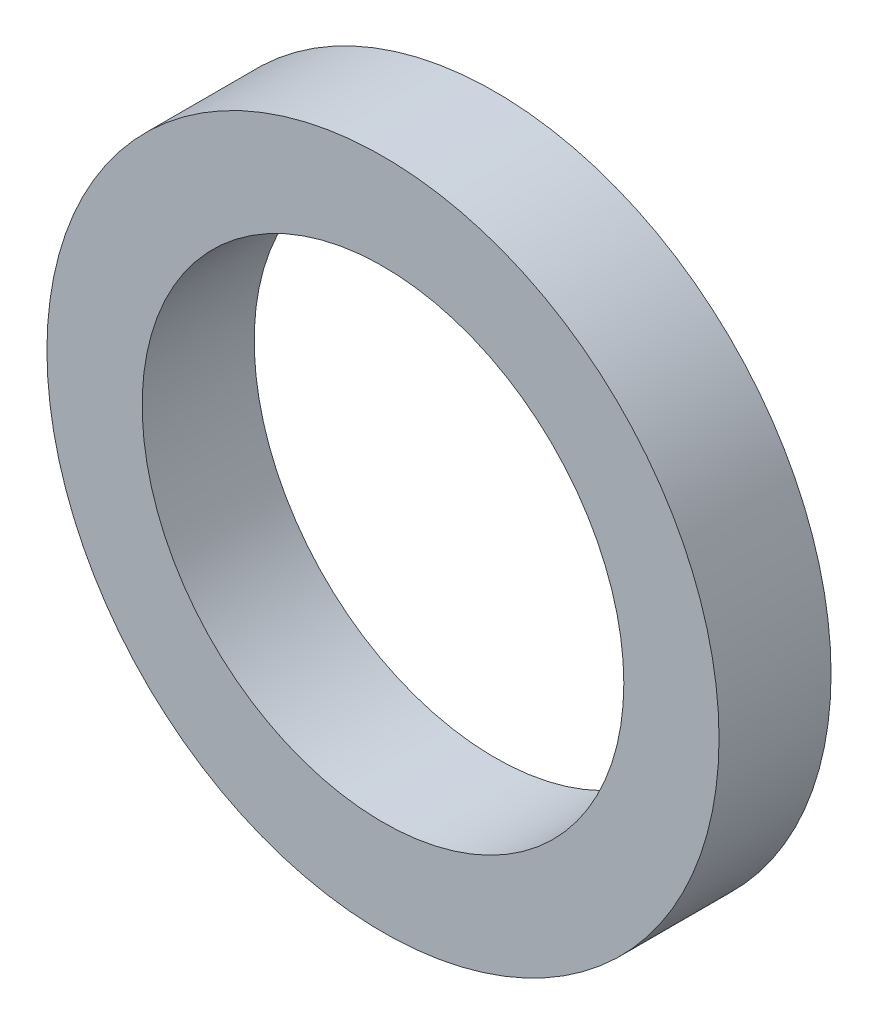
ISO-10303-21;
HEADER;
FILE_DESCRIPTION(('STEP AP214'),'2;1');
FILE_NAME('part.step','',(''),(''),'','','');
FILE_SCHEMA(('AUTOMOTIVE_DESIGN { 1 0 10303 214 1 1 1 1 }'));
ENDSEC;
DATA;
#1=APPLICATION_CONTEXT('core data for automotive mechanical design processes');
#2=APPLICATION_PROTOCOL_DEFINITION('international standard','automotive_design',2000,#1);
#3=PRODUCT_CONTEXT('',#1,'mechanical');
#4=PRODUCT('Part','Part','',(#3));
#5=PRODUCT_RELATED_PRODUCT_CATEGORY('part','',(#4));
#6=PRODUCT_DEFINITION_FORMATION('','',#4);
#7=PRODUCT_DEFINITION_CONTEXT('part definition',#1,'design');
#8=PRODUCT_DEFINITION('design','',#6,#7);
#9=PRODUCT_DEFINITION_SHAPE('','',#8);
#10=(LENGTH_UNIT() NAMED_UNIT(*) SI_UNIT(.MILLI.,.METRE.));
#11=(NAMED_UNIT(*) PLANE_ANGLE_UNIT() SI_UNIT($,.RADIAN.));
#12=(NAMED_UNIT(*) SI_UNIT($,.STERADIAN.) SOLID_ANGLE_UNIT());
#13=UNCERTAINTY_MEASURE_WITH_UNIT(LENGTH_MEASURE(1.E-05),#10,'distance_accuracy_value','');
#14=(GEOMETRIC_REPRESENTATION_CONTEXT(3) GLOBAL_UNCERTAINTY_ASSIGNED_CONTEXT((#13)) GLOBAL_UNIT_ASSIGNED_CONTEXT((#10,
#11,#12)) REPRESENTATION_CONTEXT('',''));
#15=CARTESIAN_POINT('',(0.,0.,0.));
#16=DIRECTION('',(0.,0.,1.));
#17=DIRECTION('',(1.,0.,0.));
#18=AXIS2_PLACEMENT_3D('',#15,#16,#17);
#19=CARTESIAN_POINT('',(0.,0.,-0.5));
#20=DIRECTION('',(0.,0.,1.));
#21=DIRECTION('',(1.,0.,0.));
#22=AXIS2_PLACEMENT_3D('',#19,#20,#21);
#23=CYLINDRICAL_SURFACE('',#22,3.);
#24=CARTESIAN_POINT('',(0.,0.,-0.5));
#25=DIRECTION('',(0.,0.,1.));
#26=DIRECTION('',(1.,0.,0.));
#27=AXIS2_PLACEMENT_3D('',#24,#25,#26);
#28=CIRCLE('',#27,3.);
#29=CARTESIAN_POINT('',(3.,0.,-0.5));
#30=VERTEX_POINT('',#29);
#31=EDGE_CURVE('E10',#30,#30,#28,.T.);
#32=ORIENTED_EDGE('',*,*,#31,.T.);
#33=EDGE_LOOP('',(#32));
#34=FACE_BOUND('',#33,.T.);
#35=CARTESIAN_POINT('',(0.,0.,0.5));
#36=DIRECTION('',(0.,0.,1.));
#37=DIRECTION('',(1.,0.,0.));
#38=AXIS2_PLACEMENT_3D('',#35,#36,#37);
#39=CIRCLE('',#38,3.);
#40=CARTESIAN_POINT('',(3.,0.,0.5));
#41=VERTEX_POINT('',#40);
#42=EDGE_CURVE('E42',#41,#41,#39,.T.);
#43=ORIENTED_EDGE('',*,*,#42,.F.);
#44=EDGE_LOOP('',(#43));
#45=FACE_BOUND('',#44,.T.);
#46=ADVANCED_FACE('F32',(#34,#45),#23,.T.);
#47=CARTESIAN_POINT('',(0.,0.,-0.5));
#48=DIRECTION('',(0.,0.,1.));
#49=DIRECTION('',(1.,0.,0.));
#50=AXIS2_PLACEMENT_3D('',#47,#48,#49);
#51=PLANE('',#50);
#52=CARTESIAN_POINT('',(0.,0.,-0.5));
#53=DIRECTION('',(0.,0.,1.));
#54=DIRECTION('',(1.,0.,0.));
#55=AXIS2_PLACEMENT_3D('',#52,#53,#54);
#56=CIRCLE('',#55,2.15);
#57=CARTESIAN_POINT('',(2.15,0.,-0.5));
#58=VERTEX_POINT('',#57);
#59=EDGE_CURVE('E38',#58,#58,#56,.T.);
#60=ORIENTED_EDGE('',*,*,#59,.T.);
#61=EDGE_LOOP('',(#60));
#62=FACE_BOUND('',#61,.T.);
#63=ORIENTED_EDGE('',*,*,#31,.F.);
#64=EDGE_LOOP('',(#63));
#65=FACE_BOUND('',#64,.T.);
#66=ADVANCED_FACE('F61',(#62,#65),#51,.F.);
#67=CARTESIAN_POINT('',(0.,0.,-0.5));
#68=DIRECTION('',(0.,0.,1.));
#69=DIRECTION('',(1.,0.,0.));
#70=AXIS2_PLACEMENT_3D('',#67,#68,#69);
#71=CYLINDRICAL_SURFACE('',#70,2.15);
#72=ORIENTED_EDGE('',*,*,#59,.F.);
#73=EDGE_LOOP('',(#72));
#74=FACE_BOUND('',#73,.T.);
#75=CARTESIAN_POINT('',(0.,0.,0.5));
#76=DIRECTION('',(0.,0.,1.));
#77=DIRECTION('',(1.,0.,0.));
#78=AXIS2_PLACEMENT_3D('',#75,#76,#77);
#79=CIRCLE('',#78,2.15);
#80=CARTESIAN_POINT('',(2.15,0.,0.5));
#81=VERTEX_POINT('',#80);
#82=EDGE_CURVE('E46',#81,#81,#79,.T.);
#83=ORIENTED_EDGE('',*,*,#82,.T.);
#84=EDGE_LOOP('',(#83));
#85=FACE_BOUND('',#84,.T.);
#86=ADVANCED_FACE('F52',(#74,#85),#71,.F.);
#87=CARTESIAN_POINT('',(0.,0.,0.5));
#88=DIRECTION('',(0.,0.,1.));
#89=DIRECTION('',(1.,0.,0.));
#90=AXIS2_PLACEMENT_3D('',#87,#88,#89);
#91=PLANE('',#90);
#92=ORIENTED_EDGE('',*,*,#42,.T.);
#93=EDGE_LOOP('',(#92));
#94=FACE_BOUND('',#93,.T.);
#95=ORIENTED_EDGE('',*,*,#82,.F.);
#96=EDGE_LOOP('',(#95));
#97=FACE_BOUND('',#96,.T.);
#98=ADVANCED_FACE('F54',(#94,#97),#91,.T.);
#99=CLOSED_SHELL('',(#46,#66,#86,#98));
#100=MANIFOLD_SOLID_BREP('B2',#99);
#101=ADVANCED_BREP_SHAPE_REPRESENTATION('',(#18,#100),#14);
#102=SHAPE_DEFINITION_REPRESENTATION(#9,#101);
ENDSEC;
END-ISO-10303-21;
